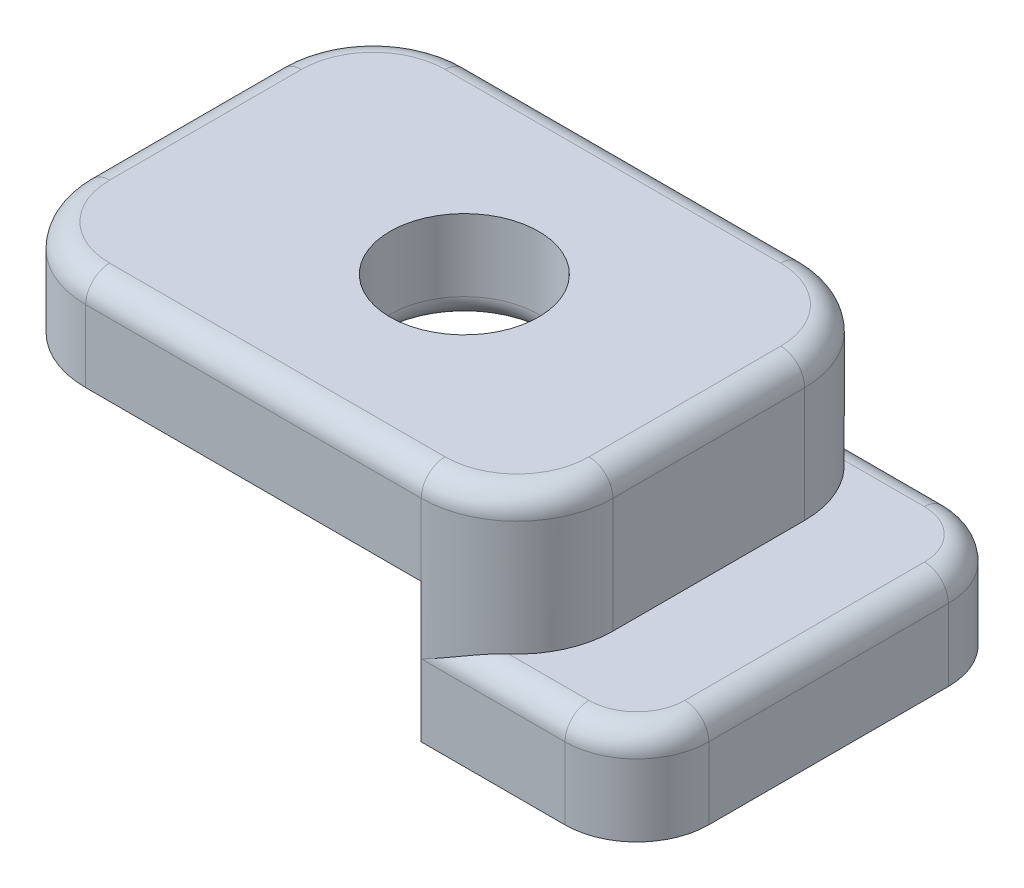
ISO-10303-21;
HEADER;
FILE_DESCRIPTION(('STEP AP214'),'2;1');
FILE_NAME('part.step','',(''),(''),'','','');
FILE_SCHEMA(('AUTOMOTIVE_DESIGN { 1 0 10303 214 1 1 1 1 }'));
ENDSEC;
DATA;
#1=APPLICATION_CONTEXT('core data for automotive mechanical design processes');
#2=APPLICATION_PROTOCOL_DEFINITION('international standard','automotive_design',2000,#1);
#3=PRODUCT_CONTEXT('',#1,'mechanical');
#4=PRODUCT('Part','Part','',(#3));
#5=PRODUCT_RELATED_PRODUCT_CATEGORY('part','',(#4));
#6=PRODUCT_DEFINITION_FORMATION('','',#4);
#7=PRODUCT_DEFINITION_CONTEXT('part definition',#1,'design');
#8=PRODUCT_DEFINITION('design','',#6,#7);
#9=PRODUCT_DEFINITION_SHAPE('','',#8);
#10=(LENGTH_UNIT() NAMED_UNIT(*) SI_UNIT(.MILLI.,.METRE.));
#11=(NAMED_UNIT(*) PLANE_ANGLE_UNIT() SI_UNIT($,.RADIAN.));
#12=(NAMED_UNIT(*) SI_UNIT($,.STERADIAN.) SOLID_ANGLE_UNIT());
#13=UNCERTAINTY_MEASURE_WITH_UNIT(LENGTH_MEASURE(1.E-05),#10,'distance_accuracy_value','');
#14=(GEOMETRIC_REPRESENTATION_CONTEXT(3) GLOBAL_UNCERTAINTY_ASSIGNED_CONTEXT((#13)) GLOBAL_UNIT_ASSIGNED_CONTEXT((#10,
#11,#12)) REPRESENTATION_CONTEXT('',''));
#15=CARTESIAN_POINT('',(0.,0.,0.));
#16=DIRECTION('',(0.,0.,1.));
#17=DIRECTION('',(1.,0.,0.));
#18=AXIS2_PLACEMENT_3D('',#15,#16,#17);
#19=CARTESIAN_POINT('',(3.5,2.,2.));
#20=DIRECTION('',(0.,-1.,0.));
#21=DIRECTION('',(0.,0.,-1.));
#22=AXIS2_PLACEMENT_3D('',#19,#20,#21);
#23=CYLINDRICAL_SURFACE('',#22,2.);
#24=DIRECTION('',(0.,-1.,0.));
#25=VECTOR('',#24,1.);
#26=CARTESIAN_POINT('',(5.5,2.,2.));
#27=LINE('',#26,#25);
#28=CARTESIAN_POINT('',(5.5,1.5,2.));
#29=VERTEX_POINT('',#28);
#30=CARTESIAN_POINT('',(5.5,-0.9,2.));
#31=VERTEX_POINT('',#30);
#32=EDGE_CURVE('E176',#29,#31,#27,.T.);
#33=ORIENTED_EDGE('',*,*,#32,.F.);
#34=CARTESIAN_POINT('',(3.5,1.5,2.));
#35=DIRECTION('',(0.,1.,0.));
#36=DIRECTION('',(0.,0.,1.));
#37=AXIS2_PLACEMENT_3D('',#34,#35,#36);
#38=CIRCLE('',#37,2.);
#39=CARTESIAN_POINT('',(3.5,1.5,4.));
#40=VERTEX_POINT('',#39);
#41=EDGE_CURVE('E285',#29,#40,#38,.F.);
#42=ORIENTED_EDGE('',*,*,#41,.T.);
#43=DIRECTION('',(0.,-1.,0.));
#44=VECTOR('',#43,1.);
#45=CARTESIAN_POINT('',(3.5,2.,4.));
#46=LINE('',#45,#44);
#47=CARTESIAN_POINT('',(3.5,0.,4.));
#48=VERTEX_POINT('',#47);
#49=EDGE_CURVE('E187',#40,#48,#46,.T.);
#50=ORIENTED_EDGE('',*,*,#49,.T.);
#51=DIRECTION('',(0.,1.,0.));
#52=VECTOR('',#51,1.);
#53=CARTESIAN_POINT('',(3.5,-2.9,4.));
#54=LINE('',#53,#52);
#55=CARTESIAN_POINT('',(3.5,-1.4,4.));
#56=VERTEX_POINT('',#55);
#57=EDGE_CURVE('E234',#56,#48,#54,.T.);
#58=ORIENTED_EDGE('',*,*,#57,.F.);
#59=CARTESIAN_POINT('',(4.8228756555323,-0.9,3.5));
#60=CARTESIAN_POINT('',(4.79845275419291,-0.900010411467476,3.52154355257095));
#61=CARTESIAN_POINT('',(4.77353061636779,-0.901390283289634,3.54245741418274));
#62=CARTESIAN_POINT('',(4.72289254665399,-0.90649832439411,3.58290199026405));
#63=CARTESIAN_POINT('',(4.69717822868774,-0.910221985243826,3.60243528029808));
#64=CARTESIAN_POINT('',(4.61944495996467,-0.924255332476501,3.65858499657072));
#65=CARTESIAN_POINT('',(4.56642280728999,-0.937440743507533,3.69311337358856));
#66=CARTESIAN_POINT('',(4.47062269700943,-0.96574389704176,3.74936132710876));
#67=CARTESIAN_POINT('',(4.42817149449629,-0.97978997791442,3.77222504946674));
#68=CARTESIAN_POINT('',(4.34248092653228,-1.01044334270582,3.81452696356911));
#69=CARTESIAN_POINT('',(4.29924124336695,-1.0270516801234,3.83396373921229));
#70=CARTESIAN_POINT('',(4.16825897389752,-1.07994999938815,3.8874197971662));
#71=CARTESIAN_POINT('',(4.07961086885534,-1.11919775960504,3.916378213666));
#72=CARTESIAN_POINT('',(3.91050160700483,-1.19762139815219,3.95915616529427));
#73=CARTESIAN_POINT('',(3.83014737071492,-1.23638060742798,3.97423652527798));
#74=CARTESIAN_POINT('',(3.66917377258249,-1.31543353741697,3.99447592235285));
#75=CARTESIAN_POINT('',(3.58855573090347,-1.35572278625283,3.9996618972833));
#76=CARTESIAN_POINT('',(3.50533326775844,-1.39733336930447,3.9999946628835));
#77=CARTESIAN_POINT('',(3.50266659422679,-1.39866670626951,3.99999999557329));
#78=CARTESIAN_POINT('',(3.5,-1.4,4.));
#79=B_SPLINE_CURVE_WITH_KNOTS('',3,(#59,#60,#61,#62,#63,#64,#65,#66,#67,#68,#69,#70,#71,#72,#73,
#74,#75,#76,#77,#78),.UNSPECIFIED.,.F.,.F.,(4,2,2,2,2,2,2,2,2,4),(0.,0.0975966634311787,
0.195006164580547,0.388196470326693,0.538676093841788,0.689217754352718,0.991572844675029,
1.26249642313569,1.53268134341627,1.54162562963826),.UNSPECIFIED.);
#80=CARTESIAN_POINT('',(4.8228756555323,-0.9,3.5));
#81=VERTEX_POINT('',#80);
#82=EDGE_CURVE('E11',#56,#81,#79,.F.);
#83=ORIENTED_EDGE('',*,*,#82,.T.);
#84=CARTESIAN_POINT('',(3.5,-0.9,2.));
#85=DIRECTION('',(0.,1.,0.));
#86=DIRECTION('',(0.,0.,-1.));
#87=AXIS2_PLACEMENT_3D('',#84,#85,#86);
#88=CIRCLE('',#87,2.);
#89=EDGE_CURVE('E191',#81,#31,#88,.T.);
#90=ORIENTED_EDGE('',*,*,#89,.T.);
#91=EDGE_LOOP('',(#33,#42,#50,#58,#83,#90));
#92=FACE_BOUND('',#91,.T.);
#93=ADVANCED_FACE('F35',(#92),#23,.T.);
#94=CARTESIAN_POINT('',(5.5,2.,-2.));
#95=DIRECTION('',(-1.,0.,0.));
#96=DIRECTION('',(0.,0.,1.));
#97=AXIS2_PLACEMENT_3D('',#94,#95,#96);
#98=PLANE('',#97);
#99=DIRECTION('',(0.,-1.,0.));
#100=VECTOR('',#99,1.);
#101=CARTESIAN_POINT('',(5.5,2.,-2.));
#102=LINE('',#101,#100);
#103=CARTESIAN_POINT('',(5.5,1.5,-2.));
#104=VERTEX_POINT('',#103);
#105=CARTESIAN_POINT('',(5.5,-0.9,-2.));
#106=VERTEX_POINT('',#105);
#107=EDGE_CURVE('E188',#104,#106,#102,.T.);
#108=ORIENTED_EDGE('',*,*,#107,.F.);
#109=DIRECTION('',(0.,0.,-1.));
#110=VECTOR('',#109,1.);
#111=CARTESIAN_POINT('',(5.5,1.5,2.));
#112=LINE('',#111,#110);
#113=EDGE_CURVE('E183',#104,#29,#112,.F.);
#114=ORIENTED_EDGE('',*,*,#113,.T.);
#115=ORIENTED_EDGE('',*,*,#32,.T.);
#116=DIRECTION('',(0.,0.,-1.));
#117=VECTOR('',#116,1.);
#118=CARTESIAN_POINT('',(5.5,-0.9,2.));
#119=LINE('',#118,#117);
#120=EDGE_CURVE('E181',#31,#106,#119,.T.);
#121=ORIENTED_EDGE('',*,*,#120,.T.);
#122=EDGE_LOOP('',(#108,#114,#115,#121));
#123=FACE_BOUND('',#122,.T.);
#124=ADVANCED_FACE('F179',(#123),#98,.F.);
#125=CARTESIAN_POINT('',(3.5,2.,-2.));
#126=DIRECTION('',(0.,-1.,0.));
#127=DIRECTION('',(0.,0.,-1.));
#128=AXIS2_PLACEMENT_3D('',#125,#126,#127);
#129=CYLINDRICAL_SURFACE('',#128,2.);
#130=DIRECTION('',(0.,-1.,0.));
#131=VECTOR('',#130,1.);
#132=CARTESIAN_POINT('',(3.5,2.,-4.));
#133=LINE('',#132,#131);
#134=CARTESIAN_POINT('',(3.5,1.5,-4.));
#135=VERTEX_POINT('',#134);
#136=CARTESIAN_POINT('',(3.5,0.,-4.));
#137=VERTEX_POINT('',#136);
#138=EDGE_CURVE('E258',#135,#137,#133,.T.);
#139=ORIENTED_EDGE('',*,*,#138,.F.);
#140=CARTESIAN_POINT('',(3.5,1.5,-2.));
#141=DIRECTION('',(0.,1.,0.));
#142=DIRECTION('',(0.,0.,1.));
#143=AXIS2_PLACEMENT_3D('',#140,#141,#142);
#144=CIRCLE('',#143,2.);
#145=EDGE_CURVE('E297',#135,#104,#144,.F.);
#146=ORIENTED_EDGE('',*,*,#145,.T.);
#147=ORIENTED_EDGE('',*,*,#107,.T.);
#148=CARTESIAN_POINT('',(3.5,-0.9,-2.));
#149=DIRECTION('',(0.,1.,0.));
#150=DIRECTION('',(0.,0.,-1.));
#151=AXIS2_PLACEMENT_3D('',#148,#149,#150);
#152=CIRCLE('',#151,2.);
#153=CARTESIAN_POINT('',(4.8228756555323,-0.9,-3.5));
#154=VERTEX_POINT('',#153);
#155=EDGE_CURVE('E196',#106,#154,#152,.T.);
#156=ORIENTED_EDGE('',*,*,#155,.T.);
#157=CARTESIAN_POINT('',(4.8228756555323,-0.9,-3.5));
#158=CARTESIAN_POINT('',(4.79845275419291,-0.900010411467476,-3.52154355257096));
#159=CARTESIAN_POINT('',(4.77353061636778,-0.901390283289634,-3.54245741418274));
#160=CARTESIAN_POINT('',(4.72289254665397,-0.906498324394112,-3.58290199026406));
#161=CARTESIAN_POINT('',(4.69717822868773,-0.910221985243829,-3.60243528029809));
#162=CARTESIAN_POINT('',(4.61944495996466,-0.924255332476504,-3.65858499657073));
#163=CARTESIAN_POINT('',(4.56642280728998,-0.937440743507535,-3.69311337358856));
#164=CARTESIAN_POINT('',(4.47062269700943,-0.965743897041759,-3.74936132710877));
#165=CARTESIAN_POINT('',(4.4281714944963,-0.979789977914417,-3.77222504946674));
#166=CARTESIAN_POINT('',(4.34248092653229,-1.01044334270582,-3.81452696356911));
#167=CARTESIAN_POINT('',(4.29924124336696,-1.0270516801234,-3.83396373921229));
#168=CARTESIAN_POINT('',(4.16825897389752,-1.07994999938814,-3.8874197971662));
#169=CARTESIAN_POINT('',(4.07961086885532,-1.11919775960499,-3.916378213666));
#170=CARTESIAN_POINT('',(3.91050160700485,-1.19762139815224,-3.95915616529427));
#171=CARTESIAN_POINT('',(3.83014737071499,-1.23638060742814,-3.97423652527798));
#172=CARTESIAN_POINT('',(3.66917377258241,-1.31543353741681,-3.99447592235285));
#173=CARTESIAN_POINT('',(3.58855573090318,-1.35572278625224,-3.99966189728329));
#174=CARTESIAN_POINT('',(3.50533326775842,-1.39733336930443,-3.9999946628835));
#175=CARTESIAN_POINT('',(3.50266659422678,-1.39866670626949,-3.99999999557329));
#176=CARTESIAN_POINT('',(3.5,-1.4,-4.));
#177=B_SPLINE_CURVE_WITH_KNOTS('',3,(#157,#158,#159,#160,#161,#162,#163,#164,#165,#166,#167,
#168,#169,#170,#171,#172,#173,#174,#175,#176),.UNSPECIFIED.,.F.,.F.,(4,2,2,2,2,2,2,2,2,4),(0.,
0.0975966634311914,0.195006164580571,0.388196470326695,0.538676093841781,0.689217754352705,
0.991572844675034,1.26249642313569,1.53268134341627,1.54162562963826),.UNSPECIFIED.);
#178=CARTESIAN_POINT('',(3.5,-1.4,-4.));
#179=VERTEX_POINT('',#178);
#180=EDGE_CURVE('E45',#154,#179,#177,.T.);
#181=ORIENTED_EDGE('',*,*,#180,.T.);
#182=DIRECTION('',(0.,1.,0.));
#183=VECTOR('',#182,1.);
#184=CARTESIAN_POINT('',(3.5,-2.9,-4.));
#185=LINE('',#184,#183);
#186=EDGE_CURVE('E53',#179,#137,#185,.T.);
#187=ORIENTED_EDGE('',*,*,#186,.T.);
#188=EDGE_LOOP('',(#139,#146,#147,#156,#181,#187));
#189=FACE_BOUND('',#188,.T.);
#190=ADVANCED_FACE('F341',(#189),#129,.T.);
#191=CARTESIAN_POINT('',(-3.5,0.,-2.));
#192=DIRECTION('',(0.,1.,0.));
#193=DIRECTION('',(0.,0.,1.));
#194=AXIS2_PLACEMENT_3D('',#191,#192,#193);
#195=PLANE('',#194);
#196=CARTESIAN_POINT('',(0.400000000000002,0.,0.));
#197=DIRECTION('',(0.,1.,0.));
#198=DIRECTION('',(0.,0.,1.));
#199=AXIS2_PLACEMENT_3D('',#196,#197,#198);
#200=CIRCLE('',#199,2.05);
#201=CARTESIAN_POINT('',(0.400000000000002,0.,2.05));
#202=VERTEX_POINT('',#201);
#203=EDGE_CURVE('E319',#202,#202,#200,.T.);
#204=ORIENTED_EDGE('',*,*,#203,.T.);
#205=EDGE_LOOP('',(#204));
#206=FACE_BOUND('',#205,.T.);
#207=DIRECTION('',(0.,0.,-1.));
#208=VECTOR('',#207,1.);
#209=CARTESIAN_POINT('',(3.5,0.,4.));
#210=LINE('',#209,#208);
#211=EDGE_CURVE('E224',#48,#137,#210,.T.);
#212=ORIENTED_EDGE('',*,*,#211,.F.);
#213=DIRECTION('',(1.,0.,0.));
#214=VECTOR('',#213,1.);
#215=CARTESIAN_POINT('',(3.5,0.,4.));
#216=LINE('',#215,#214);
#217=CARTESIAN_POINT('',(-3.5,0.,4.));
#218=VERTEX_POINT('',#217);
#219=EDGE_CURVE('E250',#218,#48,#216,.T.);
#220=ORIENTED_EDGE('',*,*,#219,.F.);
#221=CARTESIAN_POINT('',(-3.5,0.,2.));
#222=DIRECTION('',(0.,1.,0.));
#223=DIRECTION('',(0.,0.,-1.));
#224=AXIS2_PLACEMENT_3D('',#221,#222,#223);
#225=CIRCLE('',#224,2.);
#226=CARTESIAN_POINT('',(-5.5,0.,2.));
#227=VERTEX_POINT('',#226);
#228=EDGE_CURVE('E247',#227,#218,#225,.T.);
#229=ORIENTED_EDGE('',*,*,#228,.F.);
#230=DIRECTION('',(0.,0.,1.));
#231=VECTOR('',#230,1.);
#232=CARTESIAN_POINT('',(-5.5,0.,-2.));
#233=LINE('',#232,#231);
#234=CARTESIAN_POINT('',(-5.5,0.,-2.));
#235=VERTEX_POINT('',#234);
#236=EDGE_CURVE('E244',#235,#227,#233,.T.);
#237=ORIENTED_EDGE('',*,*,#236,.F.);
#238=CARTESIAN_POINT('',(-3.5,0.,-2.));
#239=DIRECTION('',(0.,1.,0.));
#240=DIRECTION('',(0.,0.,1.));
#241=AXIS2_PLACEMENT_3D('',#238,#239,#240);
#242=CIRCLE('',#241,2.);
#243=CARTESIAN_POINT('',(-3.5,0.,-4.));
#244=VERTEX_POINT('',#243);
#245=EDGE_CURVE('E241',#244,#235,#242,.T.);
#246=ORIENTED_EDGE('',*,*,#245,.F.);
#247=DIRECTION('',(-1.,0.,0.));
#248=VECTOR('',#247,1.);
#249=CARTESIAN_POINT('',(3.5,0.,-4.));
#250=LINE('',#249,#248);
#251=EDGE_CURVE('E253',#137,#244,#250,.T.);
#252=ORIENTED_EDGE('',*,*,#251,.F.);
#253=EDGE_LOOP('',(#212,#220,#229,#237,#246,#252));
#254=FACE_BOUND('',#253,.T.);
#255=ADVANCED_FACE('F396',(#206,#254),#195,.F.);
#256=CARTESIAN_POINT('',(-3.5,2.,-2.));
#257=DIRECTION('',(0.,-1.,0.));
#258=DIRECTION('',(0.,0.,-1.));
#259=AXIS2_PLACEMENT_3D('',#256,#257,#258);
#260=CYLINDRICAL_SURFACE('',#259,2.);
#261=DIRECTION('',(0.,-1.,0.));
#262=VECTOR('',#261,1.);
#263=CARTESIAN_POINT('',(-5.5,2.,-2.));
#264=LINE('',#263,#262);
#265=CARTESIAN_POINT('',(-5.5,1.5,-2.));
#266=VERTEX_POINT('',#265);
#267=EDGE_CURVE('E266',#266,#235,#264,.T.);
#268=ORIENTED_EDGE('',*,*,#267,.F.);
#269=CARTESIAN_POINT('',(-3.5,1.5,-2.));
#270=DIRECTION('',(0.,1.,0.));
#271=DIRECTION('',(0.,0.,1.));
#272=AXIS2_PLACEMENT_3D('',#269,#270,#271);
#273=CIRCLE('',#272,2.);
#274=CARTESIAN_POINT('',(-3.5,1.5,-4.));
#275=VERTEX_POINT('',#274);
#276=EDGE_CURVE('E293',#266,#275,#273,.F.);
#277=ORIENTED_EDGE('',*,*,#276,.T.);
#278=DIRECTION('',(0.,-1.,0.));
#279=VECTOR('',#278,1.);
#280=CARTESIAN_POINT('',(-3.5,2.,-4.));
#281=LINE('',#280,#279);
#282=EDGE_CURVE('E256',#275,#244,#281,.T.);
#283=ORIENTED_EDGE('',*,*,#282,.T.);
#284=ORIENTED_EDGE('',*,*,#245,.T.);
#285=EDGE_LOOP('',(#268,#277,#283,#284));
#286=FACE_BOUND('',#285,.T.);
#287=ADVANCED_FACE('F393',(#286),#260,.T.);
#288=CARTESIAN_POINT('',(-5.5,2.,-2.));
#289=DIRECTION('',(1.,0.,0.));
#290=DIRECTION('',(0.,0.,-1.));
#291=AXIS2_PLACEMENT_3D('',#288,#289,#290);
#292=PLANE('',#291);
#293=DIRECTION('',(0.,-1.,0.));
#294=VECTOR('',#293,1.);
#295=CARTESIAN_POINT('',(-5.5,2.,2.));
#296=LINE('',#295,#294);
#297=CARTESIAN_POINT('',(-5.5,1.5,2.));
#298=VERTEX_POINT('',#297);
#299=EDGE_CURVE('E264',#298,#227,#296,.T.);
#300=ORIENTED_EDGE('',*,*,#299,.F.);
#301=DIRECTION('',(0.,0.,1.));
#302=VECTOR('',#301,1.);
#303=CARTESIAN_POINT('',(-5.5,1.5,-2.));
#304=LINE('',#303,#302);
#305=EDGE_CURVE('E291',#298,#266,#304,.F.);
#306=ORIENTED_EDGE('',*,*,#305,.T.);
#307=ORIENTED_EDGE('',*,*,#267,.T.);
#308=ORIENTED_EDGE('',*,*,#236,.T.);
#309=EDGE_LOOP('',(#300,#306,#307,#308));
#310=FACE_BOUND('',#309,.T.);
#311=ADVANCED_FACE('F389',(#310),#292,.F.);
#312=CARTESIAN_POINT('',(-3.5,2.,2.));
#313=DIRECTION('',(0.,-1.,0.));
#314=DIRECTION('',(0.,0.,-1.));
#315=AXIS2_PLACEMENT_3D('',#312,#313,#314);
#316=CYLINDRICAL_SURFACE('',#315,2.);
#317=DIRECTION('',(0.,-1.,0.));
#318=VECTOR('',#317,1.);
#319=CARTESIAN_POINT('',(-3.5,2.,4.));
#320=LINE('',#319,#318);
#321=CARTESIAN_POINT('',(-3.5,1.5,4.));
#322=VERTEX_POINT('',#321);
#323=EDGE_CURVE('E262',#322,#218,#320,.T.);
#324=ORIENTED_EDGE('',*,*,#323,.F.);
#325=CARTESIAN_POINT('',(-3.5,1.5,2.));
#326=DIRECTION('',(0.,1.,0.));
#327=DIRECTION('',(0.,0.,1.));
#328=AXIS2_PLACEMENT_3D('',#325,#326,#327);
#329=CIRCLE('',#328,2.);
#330=EDGE_CURVE('E289',#322,#298,#329,.F.);
#331=ORIENTED_EDGE('',*,*,#330,.T.);
#332=ORIENTED_EDGE('',*,*,#299,.T.);
#333=ORIENTED_EDGE('',*,*,#228,.T.);
#334=EDGE_LOOP('',(#324,#331,#332,#333));
#335=FACE_BOUND('',#334,.T.);
#336=ADVANCED_FACE('F385',(#335),#316,.T.);
#337=CARTESIAN_POINT('',(3.5,2.,4.));
#338=DIRECTION('',(0.,0.,-1.));
#339=DIRECTION('',(-1.,0.,0.));
#340=AXIS2_PLACEMENT_3D('',#337,#338,#339);
#341=PLANE('',#340);
#342=ORIENTED_EDGE('',*,*,#49,.F.);
#343=DIRECTION('',(1.,0.,0.));
#344=VECTOR('',#343,1.);
#345=CARTESIAN_POINT('',(-3.5,1.5,4.));
#346=LINE('',#345,#344);
#347=EDGE_CURVE('E287',#40,#322,#346,.F.);
#348=ORIENTED_EDGE('',*,*,#347,.T.);
#349=ORIENTED_EDGE('',*,*,#323,.T.);
#350=ORIENTED_EDGE('',*,*,#219,.T.);
#351=EDGE_LOOP('',(#342,#348,#349,#350));
#352=FACE_BOUND('',#351,.T.);
#353=ADVANCED_FACE('F381',(#352),#341,.F.);
#354=CARTESIAN_POINT('',(3.5,2.,-4.));
#355=DIRECTION('',(0.,0.,1.));
#356=DIRECTION('',(1.,0.,0.));
#357=AXIS2_PLACEMENT_3D('',#354,#355,#356);
#358=PLANE('',#357);
#359=ORIENTED_EDGE('',*,*,#282,.F.);
#360=DIRECTION('',(-1.,0.,0.));
#361=VECTOR('',#360,1.);
#362=CARTESIAN_POINT('',(3.5,1.5,-4.));
#363=LINE('',#362,#361);
#364=EDGE_CURVE('E295',#275,#135,#363,.F.);
#365=ORIENTED_EDGE('',*,*,#364,.T.);
#366=ORIENTED_EDGE('',*,*,#138,.T.);
#367=ORIENTED_EDGE('',*,*,#251,.T.);
#368=EDGE_LOOP('',(#359,#365,#366,#367));
#369=FACE_BOUND('',#368,.T.);
#370=ADVANCED_FACE('F384',(#369),#358,.F.);
#371=CARTESIAN_POINT('',(-3.5,2.,-2.));
#372=DIRECTION('',(0.,1.,0.));
#373=DIRECTION('',(0.,0.,1.));
#374=AXIS2_PLACEMENT_3D('',#371,#372,#373);
#375=PLANE('',#374);
#376=DIRECTION('',(1.,0.,0.));
#377=VECTOR('',#376,1.);
#378=CARTESIAN_POINT('',(3.5,2.,3.5));
#379=LINE('',#378,#377);
#380=CARTESIAN_POINT('',(-3.5,2.,3.5));
#381=VERTEX_POINT('',#380);
#382=CARTESIAN_POINT('',(3.5,2.,3.5));
#383=VERTEX_POINT('',#382);
#384=EDGE_CURVE('E280',#381,#383,#379,.T.);
#385=ORIENTED_EDGE('',*,*,#384,.T.);
#386=CARTESIAN_POINT('',(3.5,2.,2.));
#387=DIRECTION('',(0.,1.,0.));
#388=DIRECTION('',(0.,0.,1.));
#389=AXIS2_PLACEMENT_3D('',#386,#387,#388);
#390=CIRCLE('',#389,1.5);
#391=CARTESIAN_POINT('',(5.,2.,2.));
#392=VERTEX_POINT('',#391);
#393=EDGE_CURVE('E282',#383,#392,#390,.T.);
#394=ORIENTED_EDGE('',*,*,#393,.T.);
#395=DIRECTION('',(0.,0.,-1.));
#396=VECTOR('',#395,1.);
#397=CARTESIAN_POINT('',(5.,2.,-2.));
#398=LINE('',#397,#396);
#399=CARTESIAN_POINT('',(5.,2.,-2.));
#400=VERTEX_POINT('',#399);
#401=EDGE_CURVE('E268',#392,#400,#398,.T.);
#402=ORIENTED_EDGE('',*,*,#401,.T.);
#403=CARTESIAN_POINT('',(3.5,2.,-2.));
#404=DIRECTION('',(0.,1.,0.));
#405=DIRECTION('',(0.,0.,1.));
#406=AXIS2_PLACEMENT_3D('',#403,#404,#405);
#407=CIRCLE('',#406,1.5);
#408=CARTESIAN_POINT('',(3.5,2.,-3.5));
#409=VERTEX_POINT('',#408);
#410=EDGE_CURVE('E270',#400,#409,#407,.T.);
#411=ORIENTED_EDGE('',*,*,#410,.T.);
#412=DIRECTION('',(-1.,0.,0.));
#413=VECTOR('',#412,1.);
#414=CARTESIAN_POINT('',(-3.5,2.,-3.5));
#415=LINE('',#414,#413);
#416=CARTESIAN_POINT('',(-3.5,2.,-3.5));
#417=VERTEX_POINT('',#416);
#418=EDGE_CURVE('E272',#409,#417,#415,.T.);
#419=ORIENTED_EDGE('',*,*,#418,.T.);
#420=CARTESIAN_POINT('',(-3.5,2.,-2.));
#421=DIRECTION('',(0.,1.,0.));
#422=DIRECTION('',(0.,0.,1.));
#423=AXIS2_PLACEMENT_3D('',#420,#421,#422);
#424=CIRCLE('',#423,1.5);
#425=CARTESIAN_POINT('',(-5.,2.,-2.));
#426=VERTEX_POINT('',#425);
#427=EDGE_CURVE('E274',#417,#426,#424,.T.);
#428=ORIENTED_EDGE('',*,*,#427,.T.);
#429=DIRECTION('',(0.,0.,1.));
#430=VECTOR('',#429,1.);
#431=CARTESIAN_POINT('',(-5.,2.,2.));
#432=LINE('',#431,#430);
#433=CARTESIAN_POINT('',(-5.,2.,2.));
#434=VERTEX_POINT('',#433);
#435=EDGE_CURVE('E276',#426,#434,#432,.T.);
#436=ORIENTED_EDGE('',*,*,#435,.T.);
#437=CARTESIAN_POINT('',(-3.5,2.,2.));
#438=DIRECTION('',(0.,1.,0.));
#439=DIRECTION('',(0.,0.,1.));
#440=AXIS2_PLACEMENT_3D('',#437,#438,#439);
#441=CIRCLE('',#440,1.5);
#442=EDGE_CURVE('E278',#434,#381,#441,.T.);
#443=ORIENTED_EDGE('',*,*,#442,.T.);
#444=EDGE_LOOP('',(#385,#394,#402,#411,#419,#428,#436,#443));
#445=FACE_BOUND('',#444,.T.);
#446=CARTESIAN_POINT('',(0.400000000000002,2.,0.));
#447=DIRECTION('',(0.,1.,0.));
#448=DIRECTION('',(0.,0.,1.));
#449=AXIS2_PLACEMENT_3D('',#446,#447,#448);
#450=CIRCLE('',#449,1.55);
#451=CARTESIAN_POINT('',(0.400000000000002,2.,1.55));
#452=VERTEX_POINT('',#451);
#453=EDGE_CURVE('E238',#452,#452,#450,.T.);
#454=ORIENTED_EDGE('',*,*,#453,.F.);
#455=EDGE_LOOP('',(#454));
#456=FACE_BOUND('',#455,.T.);
#457=ADVANCED_FACE('F472',(#445,#456),#375,.T.);
#458=CARTESIAN_POINT('',(0.400000000000002,0.,0.));
#459=DIRECTION('',(0.,1.,0.));
#460=DIRECTION('',(0.,0.,1.));
#461=AXIS2_PLACEMENT_3D('',#458,#459,#460);
#462=CYLINDRICAL_SURFACE('',#461,1.55);
#463=CARTESIAN_POINT('',(0.400000000000002,0.5,0.));
#464=DIRECTION('',(0.,1.,0.));
#465=DIRECTION('',(0.,0.,1.));
#466=AXIS2_PLACEMENT_3D('',#463,#464,#465);
#467=CIRCLE('',#466,1.55);
#468=CARTESIAN_POINT('',(0.400000000000002,0.5,1.55));
#469=VERTEX_POINT('',#468);
#470=EDGE_CURVE('E322',#469,#469,#467,.F.);
#471=ORIENTED_EDGE('',*,*,#470,.T.);
#472=EDGE_LOOP('',(#471));
#473=FACE_BOUND('',#472,.T.);
#474=ORIENTED_EDGE('',*,*,#453,.T.);
#475=EDGE_LOOP('',(#474));
#476=FACE_BOUND('',#475,.T.);
#477=ADVANCED_FACE('F539',(#473,#476),#462,.F.);
#478=CARTESIAN_POINT('',(3.5,-2.9,4.));
#479=DIRECTION('',(1.,0.,0.));
#480=DIRECTION('',(0.,0.,-1.));
#481=AXIS2_PLACEMENT_3D('',#478,#479,#480);
#482=PLANE('',#481);
#483=ORIENTED_EDGE('',*,*,#211,.T.);
#484=ORIENTED_EDGE('',*,*,#186,.F.);
#485=CARTESIAN_POINT('',(3.5,-2.9,-4.));
#486=VERTEX_POINT('',#485);
#487=EDGE_CURVE('E232',#486,#179,#185,.T.);
#488=ORIENTED_EDGE('',*,*,#487,.F.);
#489=DIRECTION('',(0.,0.,-1.));
#490=VECTOR('',#489,1.);
#491=CARTESIAN_POINT('',(3.5,-2.9,4.));
#492=LINE('',#491,#490);
#493=CARTESIAN_POINT('',(3.5,-2.9,4.));
#494=VERTEX_POINT('',#493);
#495=EDGE_CURVE('E228',#494,#486,#492,.T.);
#496=ORIENTED_EDGE('',*,*,#495,.F.);
#497=EDGE_CURVE('E235',#494,#56,#54,.T.);
#498=ORIENTED_EDGE('',*,*,#497,.T.);
#499=ORIENTED_EDGE('',*,*,#57,.T.);
#500=EDGE_LOOP('',(#483,#484,#488,#496,#498,#499));
#501=FACE_BOUND('',#500,.T.);
#502=ADVANCED_FACE('F493',(#501),#482,.F.);
#503=CARTESIAN_POINT('',(3.5,-2.9,-2.));
#504=DIRECTION('',(0.,-1.,0.));
#505=DIRECTION('',(0.,0.,-1.));
#506=AXIS2_PLACEMENT_3D('',#503,#504,#505);
#507=PLANE('',#506);
#508=ORIENTED_EDGE('',*,*,#495,.T.);
#509=DIRECTION('',(1.,0.,0.));
#510=VECTOR('',#509,1.);
#511=CARTESIAN_POINT('',(6.5,-2.9,-4.));
#512=LINE('',#511,#510);
#513=CARTESIAN_POINT('',(6.5,-2.9,-4.));
#514=VERTEX_POINT('',#513);
#515=EDGE_CURVE('E207',#486,#514,#512,.T.);
#516=ORIENTED_EDGE('',*,*,#515,.T.);
#517=CARTESIAN_POINT('',(6.5,-2.9,-2.5));
#518=DIRECTION('',(0.,-1.,0.));
#519=DIRECTION('',(0.,0.,1.));
#520=AXIS2_PLACEMENT_3D('',#517,#518,#519);
#521=CIRCLE('',#520,1.5);
#522=CARTESIAN_POINT('',(8.,-2.9,-2.5));
#523=VERTEX_POINT('',#522);
#524=EDGE_CURVE('E210',#514,#523,#521,.T.);
#525=ORIENTED_EDGE('',*,*,#524,.T.);
#526=DIRECTION('',(0.,0.,1.));
#527=VECTOR('',#526,1.);
#528=CARTESIAN_POINT('',(8.,-2.9,2.5));
#529=LINE('',#528,#527);
#530=CARTESIAN_POINT('',(8.,-2.9,2.5));
#531=VERTEX_POINT('',#530);
#532=EDGE_CURVE('E214',#523,#531,#529,.T.);
#533=ORIENTED_EDGE('',*,*,#532,.T.);
#534=CARTESIAN_POINT('',(6.5,-2.9,2.5));
#535=DIRECTION('',(0.,-1.,0.));
#536=DIRECTION('',(0.,0.,1.));
#537=AXIS2_PLACEMENT_3D('',#534,#535,#536);
#538=CIRCLE('',#537,1.5);
#539=CARTESIAN_POINT('',(6.5,-2.9,4.));
#540=VERTEX_POINT('',#539);
#541=EDGE_CURVE('E217',#531,#540,#538,.T.);
#542=ORIENTED_EDGE('',*,*,#541,.T.);
#543=DIRECTION('',(-1.,0.,0.));
#544=VECTOR('',#543,1.);
#545=CARTESIAN_POINT('',(3.5,-2.9,4.));
#546=LINE('',#545,#544);
#547=EDGE_CURVE('E220',#540,#494,#546,.T.);
#548=ORIENTED_EDGE('',*,*,#547,.T.);
#549=EDGE_LOOP('',(#508,#516,#525,#533,#542,#548));
#550=FACE_BOUND('',#549,.T.);
#551=ADVANCED_FACE('F516',(#550),#507,.T.);
#552=CARTESIAN_POINT('',(3.5,-0.9,4.));
#553=DIRECTION('',(0.,0.,1.));
#554=DIRECTION('',(1.,0.,0.));
#555=AXIS2_PLACEMENT_3D('',#552,#553,#554);
#556=PLANE('',#555);
#557=DIRECTION('',(0.,-1.,0.));
#558=VECTOR('',#557,1.);
#559=CARTESIAN_POINT('',(6.5,-0.9,4.));
#560=LINE('',#559,#558);
#561=CARTESIAN_POINT('',(6.5,-1.4,4.));
#562=VERTEX_POINT('',#561);
#563=EDGE_CURVE('E222',#562,#540,#560,.T.);
#564=ORIENTED_EDGE('',*,*,#563,.F.);
#565=DIRECTION('',(-1.,0.,0.));
#566=VECTOR('',#565,1.);
#567=CARTESIAN_POINT('',(3.5,-1.4,4.));
#568=LINE('',#567,#566);
#569=EDGE_CURVE('E314',#562,#56,#568,.T.);
#570=ORIENTED_EDGE('',*,*,#569,.T.);
#571=ORIENTED_EDGE('',*,*,#497,.F.);
#572=ORIENTED_EDGE('',*,*,#547,.F.);
#573=EDGE_LOOP('',(#564,#570,#571,#572));
#574=FACE_BOUND('',#573,.T.);
#575=ADVANCED_FACE('F500',(#574),#556,.T.);
#576=CARTESIAN_POINT('',(6.5,-0.9,2.5));
#577=DIRECTION('',(0.,-1.,0.));
#578=DIRECTION('',(0.,0.,-1.));
#579=AXIS2_PLACEMENT_3D('',#576,#577,#578);
#580=CYLINDRICAL_SURFACE('',#579,1.5);
#581=DIRECTION('',(0.,-1.,0.));
#582=VECTOR('',#581,1.);
#583=CARTESIAN_POINT('',(8.,-0.9,2.5));
#584=LINE('',#583,#582);
#585=CARTESIAN_POINT('',(8.,-1.4,2.5));
#586=VERTEX_POINT('',#585);
#587=EDGE_CURVE('E225',#586,#531,#584,.T.);
#588=ORIENTED_EDGE('',*,*,#587,.F.);
#589=CARTESIAN_POINT('',(6.5,-1.4,2.5));
#590=DIRECTION('',(0.,-1.,0.));
#591=DIRECTION('',(0.,0.,-1.));
#592=AXIS2_PLACEMENT_3D('',#589,#590,#591);
#593=CIRCLE('',#592,1.5);
#594=EDGE_CURVE('E317',#586,#562,#593,.T.);
#595=ORIENTED_EDGE('',*,*,#594,.T.);
#596=ORIENTED_EDGE('',*,*,#563,.T.);
#597=ORIENTED_EDGE('',*,*,#541,.F.);
#598=EDGE_LOOP('',(#588,#595,#596,#597));
#599=FACE_BOUND('',#598,.T.);
#600=ADVANCED_FACE('F520',(#599),#580,.T.);
#601=CARTESIAN_POINT('',(8.,-0.9,2.5));
#602=DIRECTION('',(1.,0.,0.));
#603=DIRECTION('',(0.,0.,-1.));
#604=AXIS2_PLACEMENT_3D('',#601,#602,#603);
#605=PLANE('',#604);
#606=DIRECTION('',(0.,-1.,0.));
#607=VECTOR('',#606,1.);
#608=CARTESIAN_POINT('',(8.,-0.9,-2.5));
#609=LINE('',#608,#607);
#610=CARTESIAN_POINT('',(8.,-1.4,-2.5));
#611=VERTEX_POINT('',#610);
#612=EDGE_CURVE('E203',#611,#523,#609,.T.);
#613=ORIENTED_EDGE('',*,*,#612,.F.);
#614=DIRECTION('',(0.,0.,1.));
#615=VECTOR('',#614,1.);
#616=CARTESIAN_POINT('',(8.,-1.4,2.5));
#617=LINE('',#616,#615);
#618=EDGE_CURVE('E326',#611,#586,#617,.T.);
#619=ORIENTED_EDGE('',*,*,#618,.T.);
#620=ORIENTED_EDGE('',*,*,#587,.T.);
#621=ORIENTED_EDGE('',*,*,#532,.F.);
#622=EDGE_LOOP('',(#613,#619,#620,#621));
#623=FACE_BOUND('',#622,.T.);
#624=ADVANCED_FACE('F522',(#623),#605,.T.);
#625=CARTESIAN_POINT('',(6.5,-0.9,-2.5));
#626=DIRECTION('',(0.,-1.,0.));
#627=DIRECTION('',(0.,0.,-1.));
#628=AXIS2_PLACEMENT_3D('',#625,#626,#627);
#629=CYLINDRICAL_SURFACE('',#628,1.5);
#630=DIRECTION('',(0.,-1.,0.));
#631=VECTOR('',#630,1.);
#632=CARTESIAN_POINT('',(6.5,-0.9,-4.));
#633=LINE('',#632,#631);
#634=CARTESIAN_POINT('',(6.5,-1.4,-4.));
#635=VERTEX_POINT('',#634);
#636=EDGE_CURVE('E201',#635,#514,#633,.T.);
#637=ORIENTED_EDGE('',*,*,#636,.F.);
#638=CARTESIAN_POINT('',(6.5,-1.4,-2.5));
#639=DIRECTION('',(0.,-1.,0.));
#640=DIRECTION('',(0.,0.,-1.));
#641=AXIS2_PLACEMENT_3D('',#638,#639,#640);
#642=CIRCLE('',#641,1.5);
#643=EDGE_CURVE('E312',#635,#611,#642,.T.);
#644=ORIENTED_EDGE('',*,*,#643,.T.);
#645=ORIENTED_EDGE('',*,*,#612,.T.);
#646=ORIENTED_EDGE('',*,*,#524,.F.);
#647=EDGE_LOOP('',(#637,#644,#645,#646));
#648=FACE_BOUND('',#647,.T.);
#649=ADVANCED_FACE('F512',(#648),#629,.T.);
#650=CARTESIAN_POINT('',(6.5,-0.9,-4.));
#651=DIRECTION('',(0.,0.,-1.));
#652=DIRECTION('',(-1.,0.,0.));
#653=AXIS2_PLACEMENT_3D('',#650,#651,#652);
#654=PLANE('',#653);
#655=ORIENTED_EDGE('',*,*,#487,.T.);
#656=DIRECTION('',(1.,0.,0.));
#657=VECTOR('',#656,1.);
#658=CARTESIAN_POINT('',(6.5,-1.4,-4.));
#659=LINE('',#658,#657);
#660=EDGE_CURVE('E299',#179,#635,#659,.T.);
#661=ORIENTED_EDGE('',*,*,#660,.T.);
#662=ORIENTED_EDGE('',*,*,#636,.T.);
#663=ORIENTED_EDGE('',*,*,#515,.F.);
#664=EDGE_LOOP('',(#655,#661,#662,#663));
#665=FACE_BOUND('',#664,.T.);
#666=ADVANCED_FACE('F509',(#665),#654,.T.);
#667=CARTESIAN_POINT('',(3.5,-0.9,-2.));
#668=DIRECTION('',(0.,-1.,0.));
#669=DIRECTION('',(0.,0.,-1.));
#670=AXIS2_PLACEMENT_3D('',#667,#668,#669);
#671=PLANE('',#670);
#672=CARTESIAN_POINT('',(6.5,-0.9,-2.5));
#673=DIRECTION('',(0.,-1.,0.));
#674=DIRECTION('',(0.,0.,-1.));
#675=AXIS2_PLACEMENT_3D('',#672,#673,#674);
#676=CIRCLE('',#675,1.);
#677=CARTESIAN_POINT('',(7.5,-0.9,-2.5));
#678=VERTEX_POINT('',#677);
#679=CARTESIAN_POINT('',(6.5,-0.9,-3.5));
#680=VERTEX_POINT('',#679);
#681=EDGE_CURVE('E308',#678,#680,#676,.F.);
#682=ORIENTED_EDGE('',*,*,#681,.T.);
#683=DIRECTION('',(1.,0.,0.));
#684=VECTOR('',#683,1.);
#685=CARTESIAN_POINT('',(3.5,-0.9,-3.5));
#686=LINE('',#685,#684);
#687=EDGE_CURVE('E310',#680,#154,#686,.F.);
#688=ORIENTED_EDGE('',*,*,#687,.T.);
#689=ORIENTED_EDGE('',*,*,#155,.F.);
#690=ORIENTED_EDGE('',*,*,#120,.F.);
#691=ORIENTED_EDGE('',*,*,#89,.F.);
#692=DIRECTION('',(-1.,0.,0.));
#693=VECTOR('',#692,1.);
#694=CARTESIAN_POINT('',(6.5,-0.9,3.5));
#695=LINE('',#694,#693);
#696=CARTESIAN_POINT('',(6.5,-0.9,3.5));
#697=VERTEX_POINT('',#696);
#698=EDGE_CURVE('E306',#81,#697,#695,.F.);
#699=ORIENTED_EDGE('',*,*,#698,.T.);
#700=CARTESIAN_POINT('',(6.5,-0.9,2.5));
#701=DIRECTION('',(0.,-1.,0.));
#702=DIRECTION('',(0.,0.,-1.));
#703=AXIS2_PLACEMENT_3D('',#700,#701,#702);
#704=CIRCLE('',#703,1.);
#705=CARTESIAN_POINT('',(7.5,-0.9,2.5));
#706=VERTEX_POINT('',#705);
#707=EDGE_CURVE('E304',#697,#706,#704,.F.);
#708=ORIENTED_EDGE('',*,*,#707,.T.);
#709=DIRECTION('',(0.,0.,1.));
#710=VECTOR('',#709,1.);
#711=CARTESIAN_POINT('',(7.5,-0.9,-2.5));
#712=LINE('',#711,#710);
#713=EDGE_CURVE('E302',#706,#678,#712,.F.);
#714=ORIENTED_EDGE('',*,*,#713,.T.);
#715=EDGE_LOOP('',(#682,#688,#689,#690,#691,#699,#708,#714));
#716=FACE_BOUND('',#715,.T.);
#717=ADVANCED_FACE('F199',(#716),#671,.F.);
#718=CARTESIAN_POINT('',(-3.5,1.5,-2.));
#719=DIRECTION('',(0.,1.,0.));
#720=DIRECTION('',(0.,0.,1.));
#721=AXIS2_PLACEMENT_3D('',#718,#719,#720);
#722=TOROIDAL_SURFACE('',#721,1.5,0.5);
#723=CARTESIAN_POINT('',(-3.5,1.5,-3.5));
#724=DIRECTION('',(1.,0.,0.));
#725=DIRECTION('',(0.,0.,-1.));
#726=AXIS2_PLACEMENT_3D('',#723,#724,#725);
#727=CIRCLE('',#726,0.5);
#728=EDGE_CURVE('E432',#275,#417,#727,.T.);
#729=ORIENTED_EDGE('',*,*,#728,.F.);
#730=ORIENTED_EDGE('',*,*,#276,.F.);
#731=CARTESIAN_POINT('',(-5.,1.5,-2.));
#732=DIRECTION('',(0.,0.,1.));
#733=DIRECTION('',(1.,0.,0.));
#734=AXIS2_PLACEMENT_3D('',#731,#732,#733);
#735=CIRCLE('',#734,0.5);
#736=EDGE_CURVE('E211',#426,#266,#735,.T.);
#737=ORIENTED_EDGE('',*,*,#736,.F.);
#738=ORIENTED_EDGE('',*,*,#427,.F.);
#739=EDGE_LOOP('',(#729,#730,#737,#738));
#740=FACE_BOUND('',#739,.T.);
#741=ADVANCED_FACE('F352',(#740),#722,.T.);
#742=CARTESIAN_POINT('',(-5.,1.5,-2.));
#743=DIRECTION('',(0.,0.,-1.));
#744=DIRECTION('',(-1.,0.,0.));
#745=AXIS2_PLACEMENT_3D('',#742,#743,#744);
#746=CYLINDRICAL_SURFACE('',#745,0.5);
#747=ORIENTED_EDGE('',*,*,#736,.T.);
#748=ORIENTED_EDGE('',*,*,#305,.F.);
#749=CARTESIAN_POINT('',(-5.,1.5,2.));
#750=DIRECTION('',(0.,0.,1.));
#751=DIRECTION('',(1.,0.,0.));
#752=AXIS2_PLACEMENT_3D('',#749,#750,#751);
#753=CIRCLE('',#752,0.5);
#754=EDGE_CURVE('E435',#434,#298,#753,.T.);
#755=ORIENTED_EDGE('',*,*,#754,.F.);
#756=ORIENTED_EDGE('',*,*,#435,.F.);
#757=EDGE_LOOP('',(#747,#748,#755,#756));
#758=FACE_BOUND('',#757,.T.);
#759=ADVANCED_FACE('F416',(#758),#746,.T.);
#760=CARTESIAN_POINT('',(-3.5,1.5,-3.5));
#761=DIRECTION('',(1.,0.,0.));
#762=DIRECTION('',(0.,0.,-1.));
#763=AXIS2_PLACEMENT_3D('',#760,#761,#762);
#764=CYLINDRICAL_SURFACE('',#763,0.5);
#765=ORIENTED_EDGE('',*,*,#728,.T.);
#766=ORIENTED_EDGE('',*,*,#418,.F.);
#767=CARTESIAN_POINT('',(3.5,1.5,-3.5));
#768=DIRECTION('',(1.,0.,0.));
#769=DIRECTION('',(0.,0.,-1.));
#770=AXIS2_PLACEMENT_3D('',#767,#768,#769);
#771=CIRCLE('',#770,0.5);
#772=EDGE_CURVE('E465',#135,#409,#771,.T.);
#773=ORIENTED_EDGE('',*,*,#772,.F.);
#774=ORIENTED_EDGE('',*,*,#364,.F.);
#775=EDGE_LOOP('',(#765,#766,#773,#774));
#776=FACE_BOUND('',#775,.T.);
#777=ADVANCED_FACE('F413',(#776),#764,.T.);
#778=CARTESIAN_POINT('',(-3.5,1.5,2.));
#779=DIRECTION('',(0.,1.,0.));
#780=DIRECTION('',(0.,0.,1.));
#781=AXIS2_PLACEMENT_3D('',#778,#779,#780);
#782=TOROIDAL_SURFACE('',#781,1.5,0.5);
#783=ORIENTED_EDGE('',*,*,#754,.T.);
#784=ORIENTED_EDGE('',*,*,#330,.F.);
#785=CARTESIAN_POINT('',(-3.5,1.5,3.5));
#786=DIRECTION('',(1.,0.,0.));
#787=DIRECTION('',(0.,0.,-1.));
#788=AXIS2_PLACEMENT_3D('',#785,#786,#787);
#789=CIRCLE('',#788,0.5);
#790=EDGE_CURVE('E462',#381,#322,#789,.T.);
#791=ORIENTED_EDGE('',*,*,#790,.F.);
#792=ORIENTED_EDGE('',*,*,#442,.F.);
#793=EDGE_LOOP('',(#783,#784,#791,#792));
#794=FACE_BOUND('',#793,.T.);
#795=ADVANCED_FACE('F409',(#794),#782,.T.);
#796=CARTESIAN_POINT('',(3.5,1.5,-2.));
#797=DIRECTION('',(0.,1.,0.));
#798=DIRECTION('',(0.,0.,1.));
#799=AXIS2_PLACEMENT_3D('',#796,#797,#798);
#800=TOROIDAL_SURFACE('',#799,1.5,0.5);
#801=ORIENTED_EDGE('',*,*,#772,.T.);
#802=ORIENTED_EDGE('',*,*,#410,.F.);
#803=CARTESIAN_POINT('',(5.,1.5,-2.));
#804=DIRECTION('',(0.,0.,1.));
#805=DIRECTION('',(1.,0.,0.));
#806=AXIS2_PLACEMENT_3D('',#803,#804,#805);
#807=CIRCLE('',#806,0.5);
#808=EDGE_CURVE('E457',#104,#400,#807,.T.);
#809=ORIENTED_EDGE('',*,*,#808,.F.);
#810=ORIENTED_EDGE('',*,*,#145,.F.);
#811=EDGE_LOOP('',(#801,#802,#809,#810));
#812=FACE_BOUND('',#811,.T.);
#813=ADVANCED_FACE('F405',(#812),#800,.T.);
#814=CARTESIAN_POINT('',(-3.5,1.5,3.5));
#815=DIRECTION('',(-1.,0.,0.));
#816=DIRECTION('',(0.,0.,1.));
#817=AXIS2_PLACEMENT_3D('',#814,#815,#816);
#818=CYLINDRICAL_SURFACE('',#817,0.5);
#819=ORIENTED_EDGE('',*,*,#790,.T.);
#820=ORIENTED_EDGE('',*,*,#347,.F.);
#821=CARTESIAN_POINT('',(3.5,1.5,3.5));
#822=DIRECTION('',(1.,0.,0.));
#823=DIRECTION('',(0.,0.,-1.));
#824=AXIS2_PLACEMENT_3D('',#821,#822,#823);
#825=CIRCLE('',#824,0.5);
#826=EDGE_CURVE('E453',#383,#40,#825,.T.);
#827=ORIENTED_EDGE('',*,*,#826,.F.);
#828=ORIENTED_EDGE('',*,*,#384,.F.);
#829=EDGE_LOOP('',(#819,#820,#827,#828));
#830=FACE_BOUND('',#829,.T.);
#831=ADVANCED_FACE('F401',(#830),#818,.T.);
#832=CARTESIAN_POINT('',(5.,1.5,-2.));
#833=DIRECTION('',(0.,0.,1.));
#834=DIRECTION('',(1.,0.,0.));
#835=AXIS2_PLACEMENT_3D('',#832,#833,#834);
#836=CYLINDRICAL_SURFACE('',#835,0.5);
#837=ORIENTED_EDGE('',*,*,#808,.T.);
#838=ORIENTED_EDGE('',*,*,#401,.F.);
#839=CARTESIAN_POINT('',(5.,1.5,2.));
#840=DIRECTION('',(0.,0.,1.));
#841=DIRECTION('',(1.,0.,0.));
#842=AXIS2_PLACEMENT_3D('',#839,#840,#841);
#843=CIRCLE('',#842,0.5);
#844=EDGE_CURVE('E449',#29,#392,#843,.T.);
#845=ORIENTED_EDGE('',*,*,#844,.F.);
#846=ORIENTED_EDGE('',*,*,#113,.F.);
#847=EDGE_LOOP('',(#837,#838,#845,#846));
#848=FACE_BOUND('',#847,.T.);
#849=ADVANCED_FACE('F372',(#848),#836,.T.);
#850=CARTESIAN_POINT('',(3.5,1.5,2.));
#851=DIRECTION('',(0.,1.,0.));
#852=DIRECTION('',(0.,0.,1.));
#853=AXIS2_PLACEMENT_3D('',#850,#851,#852);
#854=TOROIDAL_SURFACE('',#853,1.5,0.5);
#855=ORIENTED_EDGE('',*,*,#826,.T.);
#856=ORIENTED_EDGE('',*,*,#41,.F.);
#857=ORIENTED_EDGE('',*,*,#844,.T.);
#858=ORIENTED_EDGE('',*,*,#393,.F.);
#859=EDGE_LOOP('',(#855,#856,#857,#858));
#860=FACE_BOUND('',#859,.T.);
#861=ADVANCED_FACE('F367',(#860),#854,.T.);
#862=CARTESIAN_POINT('',(3.5,-1.4,3.5));
#863=DIRECTION('',(1.,0.,0.));
#864=DIRECTION('',(0.,0.,-1.));
#865=AXIS2_PLACEMENT_3D('',#862,#863,#864);
#866=CYLINDRICAL_SURFACE('',#865,0.5);
#867=ORIENTED_EDGE('',*,*,#82,.F.);
#868=ORIENTED_EDGE('',*,*,#569,.F.);
#869=CARTESIAN_POINT('',(6.5,-1.4,3.5));
#870=DIRECTION('',(1.,0.,0.));
#871=DIRECTION('',(0.,0.,-1.));
#872=AXIS2_PLACEMENT_3D('',#869,#870,#871);
#873=CIRCLE('',#872,0.5);
#874=EDGE_CURVE('E39',#697,#562,#873,.T.);
#875=ORIENTED_EDGE('',*,*,#874,.F.);
#876=ORIENTED_EDGE('',*,*,#698,.F.);
#877=EDGE_LOOP('',(#867,#868,#875,#876));
#878=FACE_BOUND('',#877,.T.);
#879=ADVANCED_FACE('F363',(#878),#866,.T.);
#880=CARTESIAN_POINT('',(6.5,-1.4,2.5));
#881=DIRECTION('',(0.,-1.,0.));
#882=DIRECTION('',(0.,0.,-1.));
#883=AXIS2_PLACEMENT_3D('',#880,#881,#882);
#884=TOROIDAL_SURFACE('',#883,1.,0.5);
#885=ORIENTED_EDGE('',*,*,#874,.T.);
#886=ORIENTED_EDGE('',*,*,#594,.F.);
#887=CARTESIAN_POINT('',(7.5,-1.4,2.5));
#888=DIRECTION('',(0.,0.,-1.));
#889=DIRECTION('',(-1.,0.,0.));
#890=AXIS2_PLACEMENT_3D('',#887,#888,#889);
#891=CIRCLE('',#890,0.5);
#892=EDGE_CURVE('E443',#706,#586,#891,.T.);
#893=ORIENTED_EDGE('',*,*,#892,.F.);
#894=ORIENTED_EDGE('',*,*,#707,.F.);
#895=EDGE_LOOP('',(#885,#886,#893,#894));
#896=FACE_BOUND('',#895,.T.);
#897=ADVANCED_FACE('F360',(#896),#884,.T.);
#898=CARTESIAN_POINT('',(7.5,-1.4,2.5));
#899=DIRECTION('',(0.,0.,-1.));
#900=DIRECTION('',(-1.,0.,0.));
#901=AXIS2_PLACEMENT_3D('',#898,#899,#900);
#902=CYLINDRICAL_SURFACE('',#901,0.5);
#903=ORIENTED_EDGE('',*,*,#892,.T.);
#904=ORIENTED_EDGE('',*,*,#618,.F.);
#905=CARTESIAN_POINT('',(7.5,-1.4,-2.5));
#906=DIRECTION('',(0.,0.,-1.));
#907=DIRECTION('',(-1.,0.,0.));
#908=AXIS2_PLACEMENT_3D('',#905,#906,#907);
#909=CIRCLE('',#908,0.5);
#910=EDGE_CURVE('E441',#678,#611,#909,.T.);
#911=ORIENTED_EDGE('',*,*,#910,.F.);
#912=ORIENTED_EDGE('',*,*,#713,.F.);
#913=EDGE_LOOP('',(#903,#904,#911,#912));
#914=FACE_BOUND('',#913,.T.);
#915=ADVANCED_FACE('F356',(#914),#902,.T.);
#916=CARTESIAN_POINT('',(6.5,-1.4,-2.5));
#917=DIRECTION('',(0.,-1.,0.));
#918=DIRECTION('',(0.,0.,-1.));
#919=AXIS2_PLACEMENT_3D('',#916,#917,#918);
#920=TOROIDAL_SURFACE('',#919,1.,0.5);
#921=ORIENTED_EDGE('',*,*,#910,.T.);
#922=ORIENTED_EDGE('',*,*,#643,.F.);
#923=CARTESIAN_POINT('',(6.5,-1.4,-3.5));
#924=DIRECTION('',(-1.,0.,0.));
#925=DIRECTION('',(0.,0.,1.));
#926=AXIS2_PLACEMENT_3D('',#923,#924,#925);
#927=CIRCLE('',#926,0.5);
#928=EDGE_CURVE('E439',#680,#635,#927,.T.);
#929=ORIENTED_EDGE('',*,*,#928,.F.);
#930=ORIENTED_EDGE('',*,*,#681,.F.);
#931=EDGE_LOOP('',(#921,#922,#929,#930));
#932=FACE_BOUND('',#931,.T.);
#933=ADVANCED_FACE('F350',(#932),#920,.T.);
#934=CARTESIAN_POINT('',(6.5,-1.4,-3.5));
#935=DIRECTION('',(-1.,0.,0.));
#936=DIRECTION('',(0.,0.,1.));
#937=AXIS2_PLACEMENT_3D('',#934,#935,#936);
#938=CYLINDRICAL_SURFACE('',#937,0.5);
#939=ORIENTED_EDGE('',*,*,#180,.F.);
#940=ORIENTED_EDGE('',*,*,#687,.F.);
#941=ORIENTED_EDGE('',*,*,#928,.T.);
#942=ORIENTED_EDGE('',*,*,#660,.F.);
#943=EDGE_LOOP('',(#939,#940,#941,#942));
#944=FACE_BOUND('',#943,.T.);
#945=ADVANCED_FACE('F345',(#944),#938,.T.);
#946=CARTESIAN_POINT('',(0.400000000000002,0.5,0.));
#947=DIRECTION('',(0.,1.,0.));
#948=DIRECTION('',(0.,0.,1.));
#949=AXIS2_PLACEMENT_3D('',#946,#947,#948);
#950=TOROIDAL_SURFACE('',#949,2.05,0.5);
#951=ORIENTED_EDGE('',*,*,#470,.F.);
#952=EDGE_LOOP('',(#951));
#953=FACE_BOUND('',#952,.T.);
#954=ORIENTED_EDGE('',*,*,#203,.F.);
#955=EDGE_LOOP('',(#954));
#956=FACE_BOUND('',#955,.T.);
#957=ADVANCED_FACE('F37',(#953,#956),#950,.T.);
#958=CLOSED_SHELL('',(#93,#124,#190,#255,#287,#311,#336,#353,#370,#457,#477,#502,#551,#575,#600,
#624,#649,#666,#717,#741,#759,#777,#795,#813,#831,#849,#861,#879,#897,#915,#933,#945,#957));
#959=MANIFOLD_SOLID_BREP('B2',#958);
#960=ADVANCED_BREP_SHAPE_REPRESENTATION('',(#18,#959),#14);
#961=SHAPE_DEFINITION_REPRESENTATION(#9,#960);
ENDSEC;
END-ISO-10303-21;
